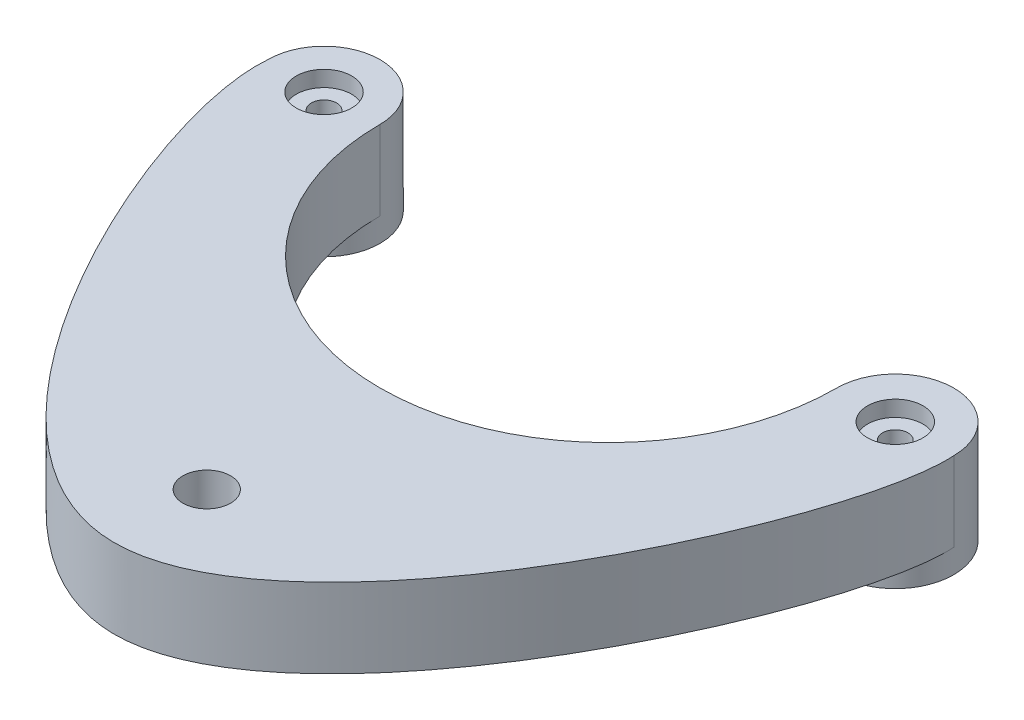
ISO-10303-21;
HEADER;
FILE_DESCRIPTION(('STEP AP214'),'2;1');
FILE_NAME('part.step','',(''),(''),'','','');
FILE_SCHEMA(('AUTOMOTIVE_DESIGN { 1 0 10303 214 1 1 1 1 }'));
ENDSEC;
DATA;
#1=APPLICATION_CONTEXT('core data for automotive mechanical design processes');
#2=APPLICATION_PROTOCOL_DEFINITION('international standard','automotive_design',2000,#1);
#3=PRODUCT_CONTEXT('',#1,'mechanical');
#4=PRODUCT('Part','Part','',(#3));
#5=PRODUCT_RELATED_PRODUCT_CATEGORY('part','',(#4));
#6=PRODUCT_DEFINITION_FORMATION('','',#4);
#7=PRODUCT_DEFINITION_CONTEXT('part definition',#1,'design');
#8=PRODUCT_DEFINITION('design','',#6,#7);
#9=PRODUCT_DEFINITION_SHAPE('','',#8);
#10=(LENGTH_UNIT() NAMED_UNIT(*) SI_UNIT(.MILLI.,.METRE.));
#11=(NAMED_UNIT(*) PLANE_ANGLE_UNIT() SI_UNIT($,.RADIAN.));
#12=(NAMED_UNIT(*) SI_UNIT($,.STERADIAN.) SOLID_ANGLE_UNIT());
#13=UNCERTAINTY_MEASURE_WITH_UNIT(LENGTH_MEASURE(1.E-05),#10,'distance_accuracy_value','');
#14=(GEOMETRIC_REPRESENTATION_CONTEXT(3) GLOBAL_UNCERTAINTY_ASSIGNED_CONTEXT((#13)) GLOBAL_UNIT_ASSIGNED_CONTEXT((#10,
#11,#12)) REPRESENTATION_CONTEXT('',''));
#15=CARTESIAN_POINT('',(0.,0.,0.));
#16=DIRECTION('',(0.,0.,1.));
#17=DIRECTION('',(1.,0.,0.));
#18=AXIS2_PLACEMENT_3D('',#15,#16,#17);
#19=CARTESIAN_POINT('',(18.,-1.5,0.));
#20=DIRECTION('',(0.,1.,0.));
#21=DIRECTION('',(0.,0.,1.));
#22=AXIS2_PLACEMENT_3D('',#19,#20,#21);
#23=CYLINDRICAL_SURFACE('',#22,0.799999999999999);
#24=CARTESIAN_POINT('',(18.,-1.5,0.));
#25=DIRECTION('',(0.,1.,0.));
#26=DIRECTION('',(0.,0.,1.));
#27=AXIS2_PLACEMENT_3D('',#24,#25,#26);
#28=CIRCLE('',#27,0.799999999999999);
#29=CARTESIAN_POINT('',(18.,-1.5,0.799999999999999));
#30=VERTEX_POINT('',#29);
#31=EDGE_CURVE('E134',#30,#30,#28,.T.);
#32=ORIENTED_EDGE('',*,*,#31,.F.);
#33=EDGE_LOOP('',(#32));
#34=FACE_BOUND('',#33,.T.);
#35=CARTESIAN_POINT('',(18.,4.,0.));
#36=DIRECTION('',(0.,1.,0.));
#37=DIRECTION('',(0.,0.,1.));
#38=AXIS2_PLACEMENT_3D('',#35,#36,#37);
#39=CIRCLE('',#38,0.799999999999999);
#40=CARTESIAN_POINT('',(18.,4.,0.799999999999999));
#41=VERTEX_POINT('',#40);
#42=EDGE_CURVE('E39',#41,#41,#39,.F.);
#43=ORIENTED_EDGE('',*,*,#42,.F.);
#44=EDGE_LOOP('',(#43));
#45=FACE_BOUND('',#44,.T.);
#46=ADVANCED_FACE('F35',(#34,#45),#23,.F.);
#47=CARTESIAN_POINT('',(-18.,-1.5,0.));
#48=DIRECTION('',(0.,1.,0.));
#49=DIRECTION('',(0.,0.,1.));
#50=AXIS2_PLACEMENT_3D('',#47,#48,#49);
#51=CYLINDRICAL_SURFACE('',#50,0.799999999999999);
#52=CARTESIAN_POINT('',(-18.,-1.5,0.));
#53=DIRECTION('',(0.,1.,0.));
#54=DIRECTION('',(0.,0.,1.));
#55=AXIS2_PLACEMENT_3D('',#52,#53,#54);
#56=CIRCLE('',#55,0.799999999999999);
#57=CARTESIAN_POINT('',(-18.,-1.5,0.799999999999997));
#58=VERTEX_POINT('',#57);
#59=EDGE_CURVE('E139',#58,#58,#56,.T.);
#60=ORIENTED_EDGE('',*,*,#59,.F.);
#61=EDGE_LOOP('',(#60));
#62=FACE_BOUND('',#61,.T.);
#63=CARTESIAN_POINT('',(-18.,4.,0.));
#64=DIRECTION('',(0.,1.,0.));
#65=DIRECTION('',(0.,0.,1.));
#66=AXIS2_PLACEMENT_3D('',#63,#64,#65);
#67=CIRCLE('',#66,0.799999999999999);
#68=CARTESIAN_POINT('',(-18.,4.,0.799999999999997));
#69=VERTEX_POINT('',#68);
#70=EDGE_CURVE('E132',#69,#69,#67,.F.);
#71=ORIENTED_EDGE('',*,*,#70,.F.);
#72=EDGE_LOOP('',(#71));
#73=FACE_BOUND('',#72,.T.);
#74=ADVANCED_FACE('F161',(#62,#73),#51,.F.);
#75=CARTESIAN_POINT('',(-18.,-1.5,0.));
#76=DIRECTION('',(0.,1.,0.));
#77=DIRECTION('',(0.,0.,1.));
#78=AXIS2_PLACEMENT_3D('',#75,#76,#77);
#79=CYLINDRICAL_SURFACE('',#78,3.53339779041136);
#80=CARTESIAN_POINT('',(-18.,-1.5,0.));
#81=DIRECTION('',(0.,1.,0.));
#82=DIRECTION('',(0.,0.,1.));
#83=AXIS2_PLACEMENT_3D('',#80,#81,#82);
#84=CIRCLE('',#83,3.53339779041136);
#85=CARTESIAN_POINT('',(-18.,-1.5,3.53339779041136));
#86=VERTEX_POINT('',#85);
#87=EDGE_CURVE('E44',#86,#86,#84,.T.);
#88=ORIENTED_EDGE('',*,*,#87,.T.);
#89=EDGE_LOOP('',(#88));
#90=FACE_BOUND('',#89,.T.);
#91=CARTESIAN_POINT('',(-18.,0.,0.));
#92=DIRECTION('',(0.,1.,0.));
#93=DIRECTION('',(0.,0.,1.));
#94=AXIS2_PLACEMENT_3D('',#91,#92,#93);
#95=CIRCLE('',#94,3.53339779041136);
#96=CARTESIAN_POINT('',(-21.5333977904114,0.,0.));
#97=VERTEX_POINT('',#96);
#98=CARTESIAN_POINT('',(-14.4666022095886,0.,0.));
#99=VERTEX_POINT('',#98);
#100=EDGE_CURVE('E52',#97,#99,#95,.T.);
#101=ORIENTED_EDGE('',*,*,#100,.F.);
#102=DIRECTION('',(0.,-1.,0.));
#103=VECTOR('',#102,1.);
#104=CARTESIAN_POINT('',(-21.5333977904114,5.,0.));
#105=LINE('',#104,#103);
#106=CARTESIAN_POINT('',(-21.5333977904114,5.,0.));
#107=VERTEX_POINT('',#106);
#108=EDGE_CURVE('E95',#107,#97,#105,.T.);
#109=ORIENTED_EDGE('',*,*,#108,.F.);
#110=CARTESIAN_POINT('',(-18.,5.,0.));
#111=DIRECTION('',(0.,1.,0.));
#112=DIRECTION('',(0.,0.,1.));
#113=AXIS2_PLACEMENT_3D('',#110,#111,#112);
#114=CIRCLE('',#113,3.53339779041135);
#115=CARTESIAN_POINT('',(-14.4666022095886,5.,0.));
#116=VERTEX_POINT('',#115);
#117=EDGE_CURVE('E103',#116,#107,#114,.T.);
#118=ORIENTED_EDGE('',*,*,#117,.F.);
#119=DIRECTION('',(0.,-1.,0.));
#120=VECTOR('',#119,1.);
#121=CARTESIAN_POINT('',(-14.4666022095886,5.,0.));
#122=LINE('',#121,#120);
#123=EDGE_CURVE('E101',#116,#99,#122,.T.);
#124=ORIENTED_EDGE('',*,*,#123,.T.);
#125=EDGE_LOOP('',(#101,#109,#118,#124));
#126=FACE_BOUND('',#125,.T.);
#127=ADVANCED_FACE('F37',(#90,#126),#79,.T.);
#128=CARTESIAN_POINT('',(-18.,-1.5,0.));
#129=DIRECTION('',(0.,1.,0.));
#130=DIRECTION('',(0.,0.,1.));
#131=AXIS2_PLACEMENT_3D('',#128,#129,#130);
#132=PLANE('',#131);
#133=ORIENTED_EDGE('',*,*,#59,.T.);
#134=EDGE_LOOP('',(#133));
#135=FACE_BOUND('',#134,.T.);
#136=ORIENTED_EDGE('',*,*,#87,.F.);
#137=EDGE_LOOP('',(#136));
#138=FACE_BOUND('',#137,.T.);
#139=ADVANCED_FACE('F160',(#135,#138),#132,.F.);
#140=CARTESIAN_POINT('',(18.,5.,0.));
#141=DIRECTION('',(0.,-1.,0.));
#142=DIRECTION('',(0.,0.,-1.));
#143=AXIS2_PLACEMENT_3D('',#140,#141,#142);
#144=CYLINDRICAL_SURFACE('',#143,3.68846037262488);
#145=DIRECTION('',(0.,-1.,0.));
#146=VECTOR('',#145,1.);
#147=CARTESIAN_POINT('',(21.6884603726249,5.,0.));
#148=LINE('',#147,#146);
#149=CARTESIAN_POINT('',(21.6884603726249,5.,0.));
#150=VERTEX_POINT('',#149);
#151=CARTESIAN_POINT('',(21.6884603726249,0.,0.));
#152=VERTEX_POINT('',#151);
#153=EDGE_CURVE('E93',#150,#152,#148,.T.);
#154=ORIENTED_EDGE('',*,*,#153,.T.);
#155=CARTESIAN_POINT('',(18.,0.,0.));
#156=DIRECTION('',(0.,-1.,0.));
#157=DIRECTION('',(0.,0.,-1.));
#158=AXIS2_PLACEMENT_3D('',#155,#156,#157);
#159=CIRCLE('',#158,3.68846037262488);
#160=CARTESIAN_POINT('',(14.3115396273751,0.,0.));
#161=VERTEX_POINT('',#160);
#162=EDGE_CURVE('E11',#152,#161,#159,.T.);
#163=ORIENTED_EDGE('',*,*,#162,.T.);
#164=DIRECTION('',(0.,-1.,0.));
#165=VECTOR('',#164,1.);
#166=CARTESIAN_POINT('',(14.3115396273751,5.,0.));
#167=LINE('',#166,#165);
#168=CARTESIAN_POINT('',(14.3115396273751,5.,0.));
#169=VERTEX_POINT('',#168);
#170=EDGE_CURVE('E110',#169,#161,#167,.T.);
#171=ORIENTED_EDGE('',*,*,#170,.F.);
#172=CARTESIAN_POINT('',(18.,5.,0.));
#173=DIRECTION('',(0.,1.,0.));
#174=DIRECTION('',(0.,0.,-1.));
#175=AXIS2_PLACEMENT_3D('',#172,#173,#174);
#176=CIRCLE('',#175,3.68846037262488);
#177=EDGE_CURVE('E96',#150,#169,#176,.T.);
#178=ORIENTED_EDGE('',*,*,#177,.F.);
#179=EDGE_LOOP('',(#154,#163,#171,#178));
#180=FACE_BOUND('',#179,.T.);
#181=CARTESIAN_POINT('',(18.,-1.5,0.));
#182=DIRECTION('',(0.,1.,0.));
#183=DIRECTION('',(0.,0.,1.));
#184=AXIS2_PLACEMENT_3D('',#181,#182,#183);
#185=CIRCLE('',#184,3.68846037262488);
#186=CARTESIAN_POINT('',(18.,-1.5,3.68846037262488));
#187=VERTEX_POINT('',#186);
#188=EDGE_CURVE('E118',#187,#187,#185,.T.);
#189=ORIENTED_EDGE('',*,*,#188,.T.);
#190=EDGE_LOOP('',(#189));
#191=FACE_BOUND('',#190,.T.);
#192=ADVANCED_FACE('F98',(#180,#191),#144,.T.);
#193=CARTESIAN_POINT('',(-0.0775312911067624,5.,0.));
#194=DIRECTION('',(0.,-1.,0.));
#195=DIRECTION('',(0.,0.,-1.));
#196=AXIS2_PLACEMENT_3D('',#193,#194,#195);
#197=CYLINDRICAL_SURFACE('',#196,14.3890709184819);
#198=CARTESIAN_POINT('',(-0.0775312911067624,0.,0.));
#199=DIRECTION('',(0.,-1.,0.));
#200=DIRECTION('',(0.,0.,-1.));
#201=AXIS2_PLACEMENT_3D('',#198,#199,#200);
#202=CIRCLE('',#201,14.3890709184819);
#203=EDGE_CURVE('E87',#161,#99,#202,.T.);
#204=ORIENTED_EDGE('',*,*,#203,.T.);
#205=ORIENTED_EDGE('',*,*,#123,.F.);
#206=CARTESIAN_POINT('',(-0.0775312911067624,5.,0.));
#207=DIRECTION('',(0.,-1.,0.));
#208=DIRECTION('',(0.,0.,-1.));
#209=AXIS2_PLACEMENT_3D('',#206,#207,#208);
#210=CIRCLE('',#209,14.3890709184819);
#211=EDGE_CURVE('E81',#169,#116,#210,.T.);
#212=ORIENTED_EDGE('',*,*,#211,.F.);
#213=ORIENTED_EDGE('',*,*,#170,.T.);
#214=EDGE_LOOP('',(#204,#205,#212,#213));
#215=FACE_BOUND('',#214,.T.);
#216=ADVANCED_FACE('F194',(#215),#197,.F.);
#217=CARTESIAN_POINT('',(-21.5333977904114,5.,0.));
#218=CARTESIAN_POINT('',(-22.1951757585387,5.,7.21548811731684));
#219=CARTESIAN_POINT('',(0.0376949845979901,5.,55.2300232433881));
#220=CARTESIAN_POINT('',(22.180786806066,5.,7.14410866361833));
#221=CARTESIAN_POINT('',(21.6884603726249,5.,0.));
#222=B_SPLINE_CURVE_WITH_KNOTS('',3,(#217,#218,#219,#220,#221),.UNSPECIFIED.,.F.,.F.,(4,1,4),
(0.,0.499656339993628,1.),.UNSPECIFIED.);
#223=DIRECTION('',(0.,-1.,0.));
#224=VECTOR('',#223,1.);
#225=SURFACE_OF_LINEAR_EXTRUSION('',#222,#224);
#226=CARTESIAN_POINT('',(-21.5333977904114,0.,0.));
#227=CARTESIAN_POINT('',(-22.1951757585387,0.,7.21548811731684));
#228=CARTESIAN_POINT('',(0.0376949845979901,0.,55.2300232433881));
#229=CARTESIAN_POINT('',(22.180786806066,0.,7.14410866361833));
#230=CARTESIAN_POINT('',(21.6884603726249,0.,0.));
#231=B_SPLINE_CURVE_WITH_KNOTS('',3,(#226,#227,#228,#229,#230),.UNSPECIFIED.,.F.,.F.,(4,1,4),
(0.,0.499656339993628,1.),.UNSPECIFIED.);
#232=EDGE_CURVE('E86',#97,#152,#231,.T.);
#233=ORIENTED_EDGE('',*,*,#232,.T.);
#234=ORIENTED_EDGE('',*,*,#153,.F.);
#235=EDGE_CURVE('E61',#107,#150,#222,.T.);
#236=ORIENTED_EDGE('',*,*,#235,.F.);
#237=ORIENTED_EDGE('',*,*,#108,.T.);
#238=EDGE_LOOP('',(#233,#234,#236,#237));
#239=FACE_BOUND('',#238,.T.);
#240=ADVANCED_FACE('F92',(#239),#225,.F.);
#241=CARTESIAN_POINT('',(18.,5.,0.));
#242=DIRECTION('',(0.,-1.,0.));
#243=DIRECTION('',(0.,0.,-1.));
#244=AXIS2_PLACEMENT_3D('',#241,#242,#243);
#245=PLANE('',#244);
#246=CARTESIAN_POINT('',(0.,5.,25.3866163248668));
#247=DIRECTION('',(0.,1.,0.));
#248=DIRECTION('',(0.,0.,1.));
#249=AXIS2_PLACEMENT_3D('',#246,#247,#248);
#250=CIRCLE('',#249,1.5);
#251=CARTESIAN_POINT('',(0.,5.,26.8866163248668));
#252=VERTEX_POINT('',#251);
#253=EDGE_CURVE('E311',#252,#252,#250,.T.);
#254=ORIENTED_EDGE('',*,*,#253,.F.);
#255=EDGE_LOOP('',(#254));
#256=FACE_BOUND('',#255,.T.);
#257=CARTESIAN_POINT('',(18.,5.,0.));
#258=DIRECTION('',(0.,1.,0.));
#259=DIRECTION('',(0.,0.,1.));
#260=AXIS2_PLACEMENT_3D('',#257,#258,#259);
#261=CIRCLE('',#260,1.75);
#262=CARTESIAN_POINT('',(18.,5.,1.75));
#263=VERTEX_POINT('',#262);
#264=EDGE_CURVE('E149',#263,#263,#261,.T.);
#265=ORIENTED_EDGE('',*,*,#264,.F.);
#266=EDGE_LOOP('',(#265));
#267=FACE_BOUND('',#266,.T.);
#268=CARTESIAN_POINT('',(-18.,5.,0.));
#269=DIRECTION('',(0.,1.,0.));
#270=DIRECTION('',(0.,0.,1.));
#271=AXIS2_PLACEMENT_3D('',#268,#269,#270);
#272=CIRCLE('',#271,1.75);
#273=CARTESIAN_POINT('',(-18.,5.,1.75));
#274=VERTEX_POINT('',#273);
#275=EDGE_CURVE('E142',#274,#274,#272,.T.);
#276=ORIENTED_EDGE('',*,*,#275,.F.);
#277=EDGE_LOOP('',(#276));
#278=FACE_BOUND('',#277,.T.);
#279=ORIENTED_EDGE('',*,*,#177,.T.);
#280=ORIENTED_EDGE('',*,*,#211,.T.);
#281=ORIENTED_EDGE('',*,*,#117,.T.);
#282=ORIENTED_EDGE('',*,*,#235,.T.);
#283=EDGE_LOOP('',(#279,#280,#281,#282));
#284=FACE_BOUND('',#283,.T.);
#285=ADVANCED_FACE('F158',(#256,#267,#278,#284),#245,.F.);
#286=CARTESIAN_POINT('',(18.,0.,0.));
#287=DIRECTION('',(0.,-1.,0.));
#288=DIRECTION('',(0.,0.,-1.));
#289=AXIS2_PLACEMENT_3D('',#286,#287,#288);
#290=PLANE('',#289);
#291=CARTESIAN_POINT('',(0.,0.,25.3866163248668));
#292=DIRECTION('',(0.,-1.,0.));
#293=DIRECTION('',(0.,0.,-1.));
#294=AXIS2_PLACEMENT_3D('',#291,#292,#293);
#295=CIRCLE('',#294,1.5);
#296=CARTESIAN_POINT('',(0.,0.,23.8866163248668));
#297=VERTEX_POINT('',#296);
#298=EDGE_CURVE('E308',#297,#297,#295,.F.);
#299=ORIENTED_EDGE('',*,*,#298,.T.);
#300=EDGE_LOOP('',(#299));
#301=FACE_BOUND('',#300,.T.);
#302=ORIENTED_EDGE('',*,*,#162,.F.);
#303=ORIENTED_EDGE('',*,*,#232,.F.);
#304=ORIENTED_EDGE('',*,*,#100,.T.);
#305=ORIENTED_EDGE('',*,*,#203,.F.);
#306=EDGE_LOOP('',(#302,#303,#304,#305));
#307=FACE_BOUND('',#306,.T.);
#308=ADVANCED_FACE('F85',(#301,#307),#290,.T.);
#309=CARTESIAN_POINT('',(18.,-1.5,0.));
#310=DIRECTION('',(0.,1.,0.));
#311=DIRECTION('',(0.,0.,1.));
#312=AXIS2_PLACEMENT_3D('',#309,#310,#311);
#313=PLANE('',#312);
#314=ORIENTED_EDGE('',*,*,#31,.T.);
#315=EDGE_LOOP('',(#314));
#316=FACE_BOUND('',#315,.T.);
#317=ORIENTED_EDGE('',*,*,#188,.F.);
#318=EDGE_LOOP('',(#317));
#319=FACE_BOUND('',#318,.T.);
#320=ADVANCED_FACE('F181',(#316,#319),#313,.F.);
#321=CARTESIAN_POINT('',(-18.,4.,0.));
#322=DIRECTION('',(0.,1.,0.));
#323=DIRECTION('',(0.,0.,1.));
#324=AXIS2_PLACEMENT_3D('',#321,#322,#323);
#325=PLANE('',#324);
#326=CARTESIAN_POINT('',(-18.,4.,0.));
#327=DIRECTION('',(0.,1.,0.));
#328=DIRECTION('',(0.,0.,1.));
#329=AXIS2_PLACEMENT_3D('',#326,#327,#328);
#330=CIRCLE('',#329,1.75);
#331=CARTESIAN_POINT('',(-18.,4.,1.75));
#332=VERTEX_POINT('',#331);
#333=EDGE_CURVE('E135',#332,#332,#330,.T.);
#334=ORIENTED_EDGE('',*,*,#333,.T.);
#335=EDGE_LOOP('',(#334));
#336=FACE_BOUND('',#335,.T.);
#337=ORIENTED_EDGE('',*,*,#70,.T.);
#338=EDGE_LOOP('',(#337));
#339=FACE_BOUND('',#338,.T.);
#340=ADVANCED_FACE('F184',(#336,#339),#325,.T.);
#341=CARTESIAN_POINT('',(-18.,4.,0.));
#342=DIRECTION('',(0.,1.,0.));
#343=DIRECTION('',(0.,0.,1.));
#344=AXIS2_PLACEMENT_3D('',#341,#342,#343);
#345=CYLINDRICAL_SURFACE('',#344,1.75);
#346=ORIENTED_EDGE('',*,*,#333,.F.);
#347=EDGE_LOOP('',(#346));
#348=FACE_BOUND('',#347,.T.);
#349=ORIENTED_EDGE('',*,*,#275,.T.);
#350=EDGE_LOOP('',(#349));
#351=FACE_BOUND('',#350,.T.);
#352=ADVANCED_FACE('F178',(#348,#351),#345,.F.);
#353=CARTESIAN_POINT('',(18.,4.,0.));
#354=DIRECTION('',(0.,1.,0.));
#355=DIRECTION('',(0.,0.,1.));
#356=AXIS2_PLACEMENT_3D('',#353,#354,#355);
#357=PLANE('',#356);
#358=CARTESIAN_POINT('',(18.,4.,0.));
#359=DIRECTION('',(0.,1.,0.));
#360=DIRECTION('',(0.,0.,1.));
#361=AXIS2_PLACEMENT_3D('',#358,#359,#360);
#362=CIRCLE('',#361,1.75);
#363=CARTESIAN_POINT('',(18.,4.,1.75));
#364=VERTEX_POINT('',#363);
#365=EDGE_CURVE('E314',#364,#364,#362,.T.);
#366=ORIENTED_EDGE('',*,*,#365,.T.);
#367=EDGE_LOOP('',(#366));
#368=FACE_BOUND('',#367,.T.);
#369=ORIENTED_EDGE('',*,*,#42,.T.);
#370=EDGE_LOOP('',(#369));
#371=FACE_BOUND('',#370,.T.);
#372=ADVANCED_FACE('F236',(#368,#371),#357,.T.);
#373=CARTESIAN_POINT('',(18.,4.,0.));
#374=DIRECTION('',(0.,1.,0.));
#375=DIRECTION('',(0.,0.,1.));
#376=AXIS2_PLACEMENT_3D('',#373,#374,#375);
#377=CYLINDRICAL_SURFACE('',#376,1.75);
#378=ORIENTED_EDGE('',*,*,#365,.F.);
#379=EDGE_LOOP('',(#378));
#380=FACE_BOUND('',#379,.T.);
#381=ORIENTED_EDGE('',*,*,#264,.T.);
#382=EDGE_LOOP('',(#381));
#383=FACE_BOUND('',#382,.T.);
#384=ADVANCED_FACE('F243',(#380,#383),#377,.F.);
#385=CARTESIAN_POINT('',(0.,-1.501,25.3866163248668));
#386=DIRECTION('',(0.,1.,0.));
#387=DIRECTION('',(0.,0.,1.));
#388=AXIS2_PLACEMENT_3D('',#385,#386,#387);
#389=CYLINDRICAL_SURFACE('',#388,1.5);
#390=ORIENTED_EDGE('',*,*,#298,.F.);
#391=EDGE_LOOP('',(#390));
#392=FACE_BOUND('',#391,.T.);
#393=ORIENTED_EDGE('',*,*,#253,.T.);
#394=EDGE_LOOP('',(#393));
#395=FACE_BOUND('',#394,.T.);
#396=ADVANCED_FACE('F250',(#392,#395),#389,.F.);
#397=CLOSED_SHELL('',(#46,#74,#127,#139,#192,#216,#240,#285,#308,#320,#340,#352,#372,#384,#396));
#398=MANIFOLD_SOLID_BREP('B2',#397);
#399=ADVANCED_BREP_SHAPE_REPRESENTATION('',(#18,#398),#14);
#400=SHAPE_DEFINITION_REPRESENTATION(#9,#399);
ENDSEC;
END-ISO-10303-21;
